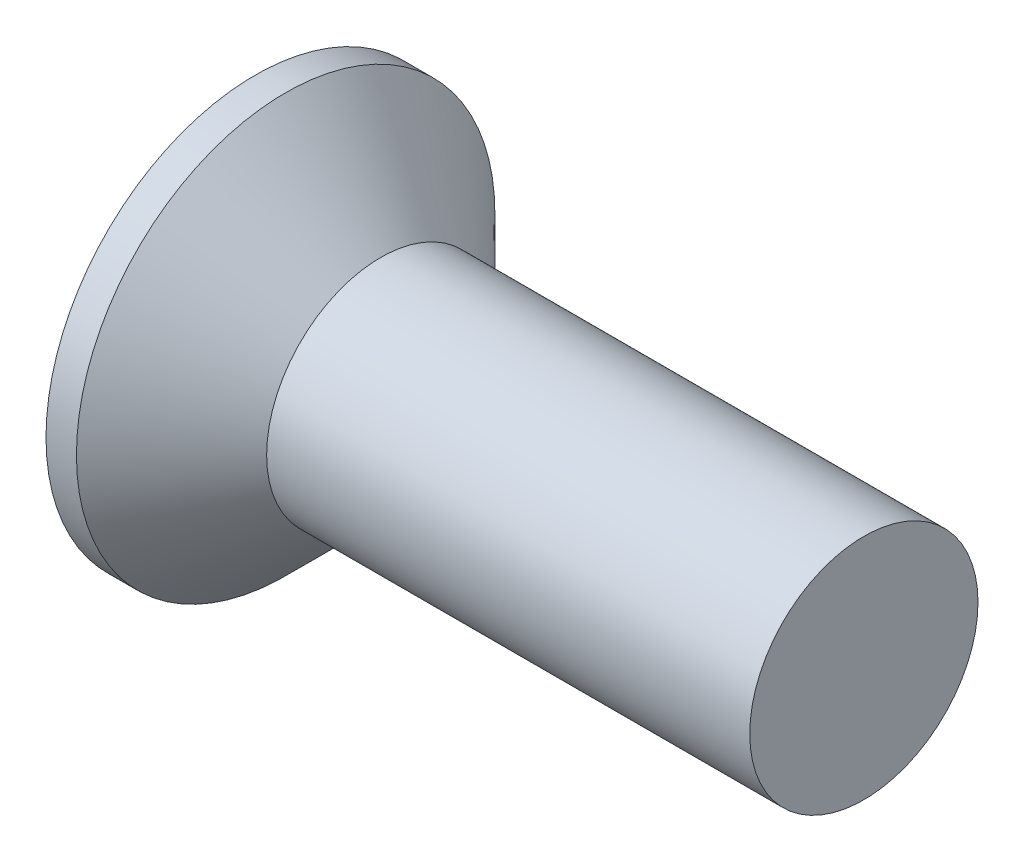
ISO-10303-21;
HEADER;
FILE_DESCRIPTION(('STEP AP214'),'2;1');
FILE_NAME('part.step','',(''),(''),'','','');
FILE_SCHEMA(('AUTOMOTIVE_DESIGN { 1 0 10303 214 1 1 1 1 }'));
ENDSEC;
DATA;
#1=APPLICATION_CONTEXT('core data for automotive mechanical design processes');
#2=APPLICATION_PROTOCOL_DEFINITION('international standard','automotive_design',2000,#1);
#3=PRODUCT_CONTEXT('',#1,'mechanical');
#4=PRODUCT('Part','Part','',(#3));
#5=PRODUCT_RELATED_PRODUCT_CATEGORY('part','',(#4));
#6=PRODUCT_DEFINITION_FORMATION('','',#4);
#7=PRODUCT_DEFINITION_CONTEXT('part definition',#1,'design');
#8=PRODUCT_DEFINITION('design','',#6,#7);
#9=PRODUCT_DEFINITION_SHAPE('','',#8);
#10=(LENGTH_UNIT() NAMED_UNIT(*) SI_UNIT(.MILLI.,.METRE.));
#11=(NAMED_UNIT(*) PLANE_ANGLE_UNIT() SI_UNIT($,.RADIAN.));
#12=(NAMED_UNIT(*) SI_UNIT($,.STERADIAN.) SOLID_ANGLE_UNIT());
#13=UNCERTAINTY_MEASURE_WITH_UNIT(LENGTH_MEASURE(1.E-05),#10,'distance_accuracy_value','');
#14=(GEOMETRIC_REPRESENTATION_CONTEXT(3) GLOBAL_UNCERTAINTY_ASSIGNED_CONTEXT((#13)) GLOBAL_UNIT_ASSIGNED_CONTEXT((#10,
#11,#12)) REPRESENTATION_CONTEXT('',''));
#15=CARTESIAN_POINT('',(0.,0.,0.));
#16=DIRECTION('',(0.,0.,1.));
#17=DIRECTION('',(1.,0.,0.));
#18=AXIS2_PLACEMENT_3D('',#15,#16,#17);
#19=CARTESIAN_POINT('',(0.,2.75,0.));
#20=DIRECTION('',(1.,0.,0.));
#21=DIRECTION('',(0.,0.,-1.));
#22=AXIS2_PLACEMENT_3D('',#19,#20,#21);
#23=PLANE('',#22);
#24=CARTESIAN_POINT('',(0.,0.,0.));
#25=DIRECTION('',(-1.,0.,0.));
#26=DIRECTION('',(0.,0.,1.));
#27=AXIS2_PLACEMENT_3D('',#24,#25,#26);
#28=CIRCLE('',#27,2.75);
#29=CARTESIAN_POINT('',(0.,0.,2.75));
#30=VERTEX_POINT('',#29);
#31=EDGE_CURVE('E45',#30,#30,#28,.T.);
#32=ORIENTED_EDGE('',*,*,#31,.T.);
#33=EDGE_LOOP('',(#32));
#34=FACE_BOUND('',#33,.T.);
#35=ADVANCED_FACE('F31',(#34),#23,.F.);
#36=CARTESIAN_POINT('',(8.,0.,0.));
#37=DIRECTION('',(-1.,0.,0.));
#38=DIRECTION('',(0.,0.,1.));
#39=AXIS2_PLACEMENT_3D('',#36,#37,#38);
#40=PLANE('',#39);
#41=CARTESIAN_POINT('',(8.,0.,0.));
#42=DIRECTION('',(-1.,0.,0.));
#43=DIRECTION('',(0.,0.,1.));
#44=AXIS2_PLACEMENT_3D('',#41,#42,#43);
#45=CIRCLE('',#44,1.5);
#46=CARTESIAN_POINT('',(8.,0.,1.5));
#47=VERTEX_POINT('',#46);
#48=EDGE_CURVE('E10',#47,#47,#45,.T.);
#49=ORIENTED_EDGE('',*,*,#48,.F.);
#50=EDGE_LOOP('',(#49));
#51=FACE_BOUND('',#50,.T.);
#52=ADVANCED_FACE('F65',(#51),#40,.F.);
#53=CARTESIAN_POINT('',(0.,0.,0.));
#54=DIRECTION('',(-1.,0.,0.));
#55=DIRECTION('',(0.,0.,1.));
#56=AXIS2_PLACEMENT_3D('',#53,#54,#55);
#57=CYLINDRICAL_SURFACE('',#56,1.5);
#58=CARTESIAN_POINT('',(1.65,0.,0.));
#59=DIRECTION('',(-1.,0.,0.));
#60=DIRECTION('',(0.,0.,1.));
#61=AXIS2_PLACEMENT_3D('',#58,#59,#60);
#62=CIRCLE('',#61,1.5);
#63=CARTESIAN_POINT('',(1.65,0.,1.5));
#64=VERTEX_POINT('',#63);
#65=EDGE_CURVE('E37',#64,#64,#62,.T.);
#66=ORIENTED_EDGE('',*,*,#65,.F.);
#67=EDGE_LOOP('',(#66));
#68=FACE_BOUND('',#67,.T.);
#69=ORIENTED_EDGE('',*,*,#48,.T.);
#70=EDGE_LOOP('',(#69));
#71=FACE_BOUND('',#70,.T.);
#72=ADVANCED_FACE('F60',(#68,#71),#57,.T.);
#73=CARTESIAN_POINT('',(1.65,0.,0.));
#74=DIRECTION('',(-1.,0.,0.));
#75=DIRECTION('',(0.,0.,1.));
#76=AXIS2_PLACEMENT_3D('',#73,#74,#75);
#77=CONICAL_SURFACE('',#76,1.5,0.78539816339745);
#78=CARTESIAN_POINT('',(0.400000000000003,0.,0.));
#79=DIRECTION('',(-1.,0.,0.));
#80=DIRECTION('',(0.,0.,1.));
#81=AXIS2_PLACEMENT_3D('',#78,#79,#80);
#82=CIRCLE('',#81,2.75);
#83=CARTESIAN_POINT('',(0.400000000000003,0.,2.75));
#84=VERTEX_POINT('',#83);
#85=EDGE_CURVE('E41',#84,#84,#82,.T.);
#86=ORIENTED_EDGE('',*,*,#85,.F.);
#87=EDGE_LOOP('',(#86));
#88=FACE_BOUND('',#87,.T.);
#89=ORIENTED_EDGE('',*,*,#65,.T.);
#90=EDGE_LOOP('',(#89));
#91=FACE_BOUND('',#90,.T.);
#92=ADVANCED_FACE('F55',(#88,#91),#77,.T.);
#93=CARTESIAN_POINT('',(0.,0.,0.));
#94=DIRECTION('',(-1.,0.,0.));
#95=DIRECTION('',(0.,0.,1.));
#96=AXIS2_PLACEMENT_3D('',#93,#94,#95);
#97=CYLINDRICAL_SURFACE('',#96,2.75);
#98=ORIENTED_EDGE('',*,*,#31,.F.);
#99=EDGE_LOOP('',(#98));
#100=FACE_BOUND('',#99,.T.);
#101=ORIENTED_EDGE('',*,*,#85,.T.);
#102=EDGE_LOOP('',(#101));
#103=FACE_BOUND('',#102,.T.);
#104=ADVANCED_FACE('F52',(#100,#103),#97,.T.);
#105=CLOSED_SHELL('',(#35,#52,#72,#92,#104));
#106=MANIFOLD_SOLID_BREP('B2',#105);
#107=ADVANCED_BREP_SHAPE_REPRESENTATION('',(#18,#106),#14);
#108=SHAPE_DEFINITION_REPRESENTATION(#9,#107);
ENDSEC;
END-ISO-10303-21;
